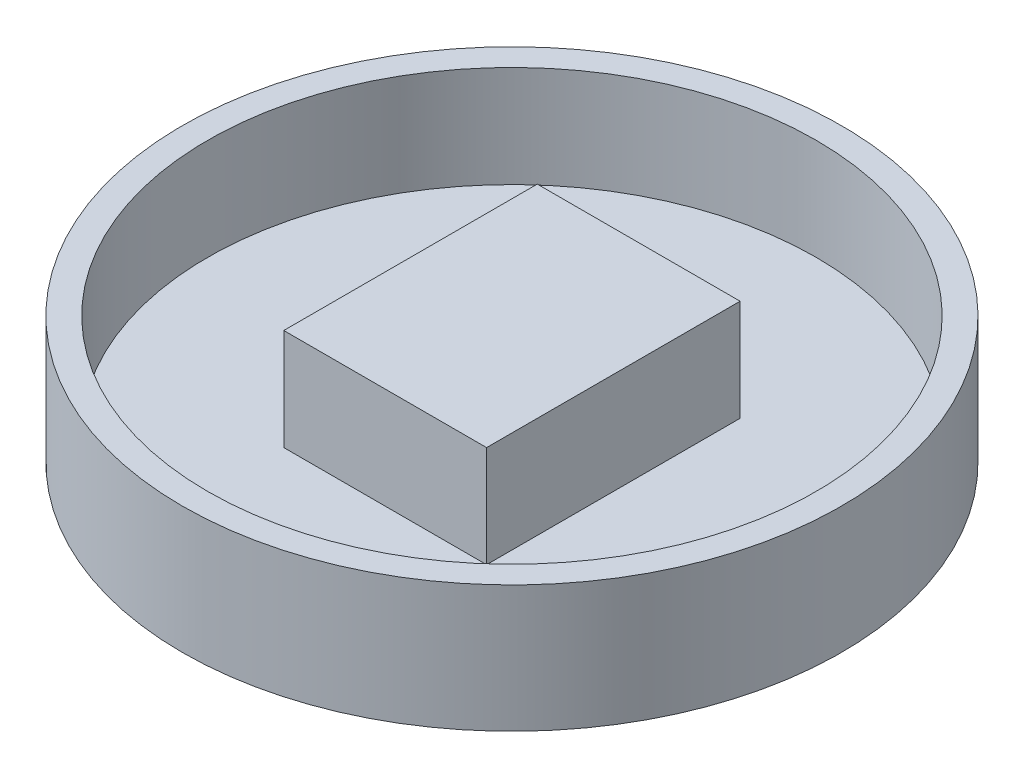
ISO-10303-21;
HEADER;
FILE_DESCRIPTION(('STEP AP214'),'2;1');
FILE_NAME('part.step','',(''),(''),'','','');
FILE_SCHEMA(('AUTOMOTIVE_DESIGN { 1 0 10303 214 1 1 1 1 }'));
ENDSEC;
DATA;
#1=APPLICATION_CONTEXT('core data for automotive mechanical design processes');
#2=APPLICATION_PROTOCOL_DEFINITION('international standard','automotive_design',2000,#1);
#3=PRODUCT_CONTEXT('',#1,'mechanical');
#4=PRODUCT('Part','Part','',(#3));
#5=PRODUCT_RELATED_PRODUCT_CATEGORY('part','',(#4));
#6=PRODUCT_DEFINITION_FORMATION('','',#4);
#7=PRODUCT_DEFINITION_CONTEXT('part definition',#1,'design');
#8=PRODUCT_DEFINITION('design','',#6,#7);
#9=PRODUCT_DEFINITION_SHAPE('','',#8);
#10=(LENGTH_UNIT() NAMED_UNIT(*) SI_UNIT(.MILLI.,.METRE.));
#11=(NAMED_UNIT(*) PLANE_ANGLE_UNIT() SI_UNIT($,.RADIAN.));
#12=(NAMED_UNIT(*) SI_UNIT($,.STERADIAN.) SOLID_ANGLE_UNIT());
#13=UNCERTAINTY_MEASURE_WITH_UNIT(LENGTH_MEASURE(1.E-05),#10,'distance_accuracy_value','');
#14=(GEOMETRIC_REPRESENTATION_CONTEXT(3) GLOBAL_UNCERTAINTY_ASSIGNED_CONTEXT((#13)) GLOBAL_UNIT_ASSIGNED_CONTEXT((#10,
#11,#12)) REPRESENTATION_CONTEXT('',''));
#15=CARTESIAN_POINT('',(0.,0.,0.));
#16=DIRECTION('',(0.,0.,1.));
#17=DIRECTION('',(1.,0.,0.));
#18=AXIS2_PLACEMENT_3D('',#15,#16,#17);
#19=CARTESIAN_POINT('',(0.,5.,0.));
#20=DIRECTION('',(0.,1.,0.));
#21=DIRECTION('',(0.,0.,1.));
#22=AXIS2_PLACEMENT_3D('',#19,#20,#21);
#23=PLANE('',#22);
#24=CARTESIAN_POINT('',(0.,5.,0.));
#25=DIRECTION('',(0.,1.,0.));
#26=DIRECTION('',(0.,0.,1.));
#27=AXIS2_PLACEMENT_3D('',#24,#25,#26);
#28=CIRCLE('',#27,60.);
#29=CARTESIAN_POINT('',(0.,5.,60.));
#30=VERTEX_POINT('',#29);
#31=EDGE_CURVE('E165',#30,#30,#28,.T.);
#32=ORIENTED_EDGE('',*,*,#31,.T.);
#33=EDGE_LOOP('',(#32));
#34=FACE_BOUND('',#33,.T.);
#35=DIRECTION('',(-1.,0.,0.));
#36=VECTOR('',#35,1.);
#37=CARTESIAN_POINT('',(-20.,5.,-25.));
#38=LINE('',#37,#36);
#39=CARTESIAN_POINT('',(20.,5.,-25.));
#40=VERTEX_POINT('',#39);
#41=CARTESIAN_POINT('',(-20.,5.,-25.));
#42=VERTEX_POINT('',#41);
#43=EDGE_CURVE('E151',#40,#42,#38,.T.);
#44=ORIENTED_EDGE('',*,*,#43,.F.);
#45=DIRECTION('',(0.,0.,-1.));
#46=VECTOR('',#45,1.);
#47=CARTESIAN_POINT('',(20.,5.,-25.));
#48=LINE('',#47,#46);
#49=CARTESIAN_POINT('',(20.,5.,25.));
#50=VERTEX_POINT('',#49);
#51=EDGE_CURVE('E134',#50,#40,#48,.T.);
#52=ORIENTED_EDGE('',*,*,#51,.F.);
#53=DIRECTION('',(1.,0.,0.));
#54=VECTOR('',#53,1.);
#55=CARTESIAN_POINT('',(-20.,5.,25.));
#56=LINE('',#55,#54);
#57=CARTESIAN_POINT('',(-20.,5.,25.));
#58=VERTEX_POINT('',#57);
#59=EDGE_CURVE('E142',#58,#50,#56,.T.);
#60=ORIENTED_EDGE('',*,*,#59,.F.);
#61=DIRECTION('',(0.,0.,1.));
#62=VECTOR('',#61,1.);
#63=CARTESIAN_POINT('',(-20.,5.,-25.));
#64=LINE('',#63,#62);
#65=EDGE_CURVE('E153',#42,#58,#64,.T.);
#66=ORIENTED_EDGE('',*,*,#65,.F.);
#67=EDGE_LOOP('',(#44,#52,#60,#66));
#68=FACE_BOUND('',#67,.T.);
#69=ADVANCED_FACE('F33',(#34,#68),#23,.T.);
#70=CARTESIAN_POINT('',(0.,25.,0.));
#71=DIRECTION('',(0.,-1.,0.));
#72=DIRECTION('',(0.,0.,-1.));
#73=AXIS2_PLACEMENT_3D('',#70,#71,#72);
#74=CYLINDRICAL_SURFACE('',#73,65.);
#75=CARTESIAN_POINT('',(0.,25.,0.));
#76=DIRECTION('',(0.,1.,0.));
#77=DIRECTION('',(0.,0.,1.));
#78=AXIS2_PLACEMENT_3D('',#75,#76,#77);
#79=CIRCLE('',#78,65.);
#80=CARTESIAN_POINT('',(0.,25.,65.));
#81=VERTEX_POINT('',#80);
#82=EDGE_CURVE('E11',#81,#81,#79,.T.);
#83=ORIENTED_EDGE('',*,*,#82,.F.);
#84=EDGE_LOOP('',(#83));
#85=FACE_BOUND('',#84,.T.);
#86=CARTESIAN_POINT('',(0.,0.,0.));
#87=DIRECTION('',(0.,1.,0.));
#88=DIRECTION('',(0.,0.,1.));
#89=AXIS2_PLACEMENT_3D('',#86,#87,#88);
#90=CIRCLE('',#89,65.);
#91=CARTESIAN_POINT('',(0.,0.,65.));
#92=VERTEX_POINT('',#91);
#93=EDGE_CURVE('E37',#92,#92,#90,.T.);
#94=ORIENTED_EDGE('',*,*,#93,.T.);
#95=EDGE_LOOP('',(#94));
#96=FACE_BOUND('',#95,.T.);
#97=ADVANCED_FACE('F35',(#85,#96),#74,.T.);
#98=CARTESIAN_POINT('',(0.,25.,0.));
#99=DIRECTION('',(0.,1.,0.));
#100=DIRECTION('',(0.,0.,1.));
#101=AXIS2_PLACEMENT_3D('',#98,#99,#100);
#102=PLANE('',#101);
#103=CARTESIAN_POINT('',(0.,25.,0.));
#104=DIRECTION('',(0.,1.,0.));
#105=DIRECTION('',(0.,0.,1.));
#106=AXIS2_PLACEMENT_3D('',#103,#104,#105);
#107=CIRCLE('',#106,60.);
#108=CARTESIAN_POINT('',(0.,25.,60.));
#109=VERTEX_POINT('',#108);
#110=EDGE_CURVE('E164',#109,#109,#107,.T.);
#111=ORIENTED_EDGE('',*,*,#110,.F.);
#112=EDGE_LOOP('',(#111));
#113=FACE_BOUND('',#112,.T.);
#114=ORIENTED_EDGE('',*,*,#82,.T.);
#115=EDGE_LOOP('',(#114));
#116=FACE_BOUND('',#115,.T.);
#117=ADVANCED_FACE('F173',(#113,#116),#102,.T.);
#118=CARTESIAN_POINT('',(0.,0.,0.));
#119=DIRECTION('',(0.,1.,0.));
#120=DIRECTION('',(0.,0.,1.));
#121=AXIS2_PLACEMENT_3D('',#118,#119,#120);
#122=PLANE('',#121);
#123=DIRECTION('',(-1.,0.,0.));
#124=VECTOR('',#123,1.);
#125=CARTESIAN_POINT('',(-17.5,0.,23.));
#126=LINE('',#125,#124);
#127=CARTESIAN_POINT('',(17.5,0.,23.));
#128=VERTEX_POINT('',#127);
#129=CARTESIAN_POINT('',(-17.5,0.,23.));
#130=VERTEX_POINT('',#129);
#131=EDGE_CURVE('E128',#128,#130,#126,.T.);
#132=ORIENTED_EDGE('',*,*,#131,.F.);
#133=DIRECTION('',(0.,0.,1.));
#134=VECTOR('',#133,1.);
#135=CARTESIAN_POINT('',(17.5,0.,23.));
#136=LINE('',#135,#134);
#137=CARTESIAN_POINT('',(17.5,0.,-4.99999999999999));
#138=VERTEX_POINT('',#137);
#139=EDGE_CURVE('E48',#138,#128,#136,.T.);
#140=ORIENTED_EDGE('',*,*,#139,.F.);
#141=DIRECTION('',(1.,0.,0.));
#142=VECTOR('',#141,1.);
#143=CARTESIAN_POINT('',(-17.5,0.,-5.));
#144=LINE('',#143,#142);
#145=CARTESIAN_POINT('',(-17.5,0.,-5.));
#146=VERTEX_POINT('',#145);
#147=EDGE_CURVE('E119',#146,#138,#144,.T.);
#148=ORIENTED_EDGE('',*,*,#147,.F.);
#149=DIRECTION('',(0.,0.,-1.));
#150=VECTOR('',#149,1.);
#151=CARTESIAN_POINT('',(-17.5,0.,23.));
#152=LINE('',#151,#150);
#153=EDGE_CURVE('E122',#130,#146,#152,.T.);
#154=ORIENTED_EDGE('',*,*,#153,.F.);
#155=EDGE_LOOP('',(#132,#140,#148,#154));
#156=FACE_BOUND('',#155,.T.);
#157=ORIENTED_EDGE('',*,*,#93,.F.);
#158=EDGE_LOOP('',(#157));
#159=FACE_BOUND('',#158,.T.);
#160=ADVANCED_FACE('F176',(#156,#159),#122,.F.);
#161=CARTESIAN_POINT('',(0.,5.,0.));
#162=DIRECTION('',(0.,1.,0.));
#163=DIRECTION('',(0.,0.,1.));
#164=AXIS2_PLACEMENT_3D('',#161,#162,#163);
#165=CYLINDRICAL_SURFACE('',#164,60.);
#166=ORIENTED_EDGE('',*,*,#31,.F.);
#167=EDGE_LOOP('',(#166));
#168=FACE_BOUND('',#167,.T.);
#169=ORIENTED_EDGE('',*,*,#110,.T.);
#170=EDGE_LOOP('',(#169));
#171=FACE_BOUND('',#170,.T.);
#172=ADVANCED_FACE('F171',(#168,#171),#165,.F.);
#173=CARTESIAN_POINT('',(20.,25.,-25.));
#174=DIRECTION('',(-1.,0.,0.));
#175=DIRECTION('',(0.,0.,1.));
#176=AXIS2_PLACEMENT_3D('',#173,#174,#175);
#177=PLANE('',#176);
#178=ORIENTED_EDGE('',*,*,#51,.T.);
#179=DIRECTION('',(0.,-1.,0.));
#180=VECTOR('',#179,1.);
#181=CARTESIAN_POINT('',(20.,25.,-25.));
#182=LINE('',#181,#180);
#183=CARTESIAN_POINT('',(20.,25.,-25.));
#184=VERTEX_POINT('',#183);
#185=EDGE_CURVE('E162',#184,#40,#182,.T.);
#186=ORIENTED_EDGE('',*,*,#185,.F.);
#187=DIRECTION('',(0.,0.,-1.));
#188=VECTOR('',#187,1.);
#189=CARTESIAN_POINT('',(20.,25.,-25.));
#190=LINE('',#189,#188);
#191=CARTESIAN_POINT('',(20.,25.,25.));
#192=VERTEX_POINT('',#191);
#193=EDGE_CURVE('E138',#192,#184,#190,.T.);
#194=ORIENTED_EDGE('',*,*,#193,.F.);
#195=DIRECTION('',(0.,-1.,0.));
#196=VECTOR('',#195,1.);
#197=CARTESIAN_POINT('',(20.,25.,25.));
#198=LINE('',#197,#196);
#199=EDGE_CURVE('E148',#192,#50,#198,.T.);
#200=ORIENTED_EDGE('',*,*,#199,.T.);
#201=EDGE_LOOP('',(#178,#186,#194,#200));
#202=FACE_BOUND('',#201,.T.);
#203=ADVANCED_FACE('F190',(#202),#177,.F.);
#204=CARTESIAN_POINT('',(-20.,25.,-25.));
#205=DIRECTION('',(0.,0.,1.));
#206=DIRECTION('',(1.,0.,0.));
#207=AXIS2_PLACEMENT_3D('',#204,#205,#206);
#208=PLANE('',#207);
#209=ORIENTED_EDGE('',*,*,#43,.T.);
#210=DIRECTION('',(0.,-1.,0.));
#211=VECTOR('',#210,1.);
#212=CARTESIAN_POINT('',(-20.,25.,-25.));
#213=LINE('',#212,#211);
#214=CARTESIAN_POINT('',(-20.,25.,-25.));
#215=VERTEX_POINT('',#214);
#216=EDGE_CURVE('E159',#215,#42,#213,.T.);
#217=ORIENTED_EDGE('',*,*,#216,.F.);
#218=DIRECTION('',(-1.,0.,0.));
#219=VECTOR('',#218,1.);
#220=CARTESIAN_POINT('',(-20.,25.,-25.));
#221=LINE('',#220,#219);
#222=EDGE_CURVE('E141',#184,#215,#221,.T.);
#223=ORIENTED_EDGE('',*,*,#222,.F.);
#224=ORIENTED_EDGE('',*,*,#185,.T.);
#225=EDGE_LOOP('',(#209,#217,#223,#224));
#226=FACE_BOUND('',#225,.T.);
#227=ADVANCED_FACE('F202',(#226),#208,.F.);
#228=CARTESIAN_POINT('',(-20.,25.,-25.));
#229=DIRECTION('',(1.,0.,0.));
#230=DIRECTION('',(0.,0.,-1.));
#231=AXIS2_PLACEMENT_3D('',#228,#229,#230);
#232=PLANE('',#231);
#233=ORIENTED_EDGE('',*,*,#65,.T.);
#234=DIRECTION('',(0.,-1.,0.));
#235=VECTOR('',#234,1.);
#236=CARTESIAN_POINT('',(-20.,25.,25.));
#237=LINE('',#236,#235);
#238=CARTESIAN_POINT('',(-20.,25.,25.));
#239=VERTEX_POINT('',#238);
#240=EDGE_CURVE('E56',#239,#58,#237,.T.);
#241=ORIENTED_EDGE('',*,*,#240,.F.);
#242=DIRECTION('',(0.,0.,1.));
#243=VECTOR('',#242,1.);
#244=CARTESIAN_POINT('',(-20.,25.,-25.));
#245=LINE('',#244,#243);
#246=EDGE_CURVE('E144',#215,#239,#245,.T.);
#247=ORIENTED_EDGE('',*,*,#246,.F.);
#248=ORIENTED_EDGE('',*,*,#216,.T.);
#249=EDGE_LOOP('',(#233,#241,#247,#248));
#250=FACE_BOUND('',#249,.T.);
#251=ADVANCED_FACE('F206',(#250),#232,.F.);
#252=CARTESIAN_POINT('',(-20.,25.,25.));
#253=DIRECTION('',(0.,0.,-1.));
#254=DIRECTION('',(-1.,0.,0.));
#255=AXIS2_PLACEMENT_3D('',#252,#253,#254);
#256=PLANE('',#255);
#257=ORIENTED_EDGE('',*,*,#59,.T.);
#258=ORIENTED_EDGE('',*,*,#199,.F.);
#259=DIRECTION('',(1.,0.,0.));
#260=VECTOR('',#259,1.);
#261=CARTESIAN_POINT('',(-20.,25.,25.));
#262=LINE('',#261,#260);
#263=EDGE_CURVE('E146',#239,#192,#262,.T.);
#264=ORIENTED_EDGE('',*,*,#263,.F.);
#265=ORIENTED_EDGE('',*,*,#240,.T.);
#266=EDGE_LOOP('',(#257,#258,#264,#265));
#267=FACE_BOUND('',#266,.T.);
#268=ADVANCED_FACE('F210',(#267),#256,.F.);
#269=CARTESIAN_POINT('',(0.,25.,0.));
#270=DIRECTION('',(0.,1.,0.));
#271=DIRECTION('',(0.,0.,1.));
#272=AXIS2_PLACEMENT_3D('',#269,#270,#271);
#273=PLANE('',#272);
#274=ORIENTED_EDGE('',*,*,#193,.T.);
#275=ORIENTED_EDGE('',*,*,#222,.T.);
#276=ORIENTED_EDGE('',*,*,#246,.T.);
#277=ORIENTED_EDGE('',*,*,#263,.T.);
#278=EDGE_LOOP('',(#274,#275,#276,#277));
#279=FACE_BOUND('',#278,.T.);
#280=ADVANCED_FACE('F214',(#279),#273,.T.);
#281=CARTESIAN_POINT('',(17.5,18.,23.));
#282=DIRECTION('',(1.,0.,0.));
#283=DIRECTION('',(0.,0.,-1.));
#284=AXIS2_PLACEMENT_3D('',#281,#282,#283);
#285=PLANE('',#284);
#286=ORIENTED_EDGE('',*,*,#139,.T.);
#287=DIRECTION('',(0.,-1.,0.));
#288=VECTOR('',#287,1.);
#289=CARTESIAN_POINT('',(17.5,18.,23.));
#290=LINE('',#289,#288);
#291=CARTESIAN_POINT('',(17.5,18.,23.));
#292=VERTEX_POINT('',#291);
#293=EDGE_CURVE('E97',#292,#128,#290,.T.);
#294=ORIENTED_EDGE('',*,*,#293,.F.);
#295=DIRECTION('',(0.,0.,1.));
#296=VECTOR('',#295,1.);
#297=CARTESIAN_POINT('',(17.5,18.,23.));
#298=LINE('',#297,#296);
#299=CARTESIAN_POINT('',(17.5,18.,-4.99999999999999));
#300=VERTEX_POINT('',#299);
#301=EDGE_CURVE('E101',#300,#292,#298,.T.);
#302=ORIENTED_EDGE('',*,*,#301,.F.);
#303=DIRECTION('',(0.,-1.,0.));
#304=VECTOR('',#303,1.);
#305=CARTESIAN_POINT('',(17.5,18.,-4.99999999999999));
#306=LINE('',#305,#304);
#307=EDGE_CURVE('E132',#300,#138,#306,.T.);
#308=ORIENTED_EDGE('',*,*,#307,.T.);
#309=EDGE_LOOP('',(#286,#294,#302,#308));
#310=FACE_BOUND('',#309,.T.);
#311=ADVANCED_FACE('F99',(#310),#285,.F.);
#312=CARTESIAN_POINT('',(-17.5,18.,-5.));
#313=DIRECTION('',(0.,0.,-1.));
#314=DIRECTION('',(-1.,0.,0.));
#315=AXIS2_PLACEMENT_3D('',#312,#313,#314);
#316=PLANE('',#315);
#317=ORIENTED_EDGE('',*,*,#147,.T.);
#318=ORIENTED_EDGE('',*,*,#307,.F.);
#319=DIRECTION('',(1.,0.,0.));
#320=VECTOR('',#319,1.);
#321=CARTESIAN_POINT('',(-17.5,18.,-5.));
#322=LINE('',#321,#320);
#323=CARTESIAN_POINT('',(-17.5,18.,-5.));
#324=VERTEX_POINT('',#323);
#325=EDGE_CURVE('E107',#324,#300,#322,.T.);
#326=ORIENTED_EDGE('',*,*,#325,.F.);
#327=DIRECTION('',(0.,-1.,0.));
#328=VECTOR('',#327,1.);
#329=CARTESIAN_POINT('',(-17.5,18.,-5.));
#330=LINE('',#329,#328);
#331=EDGE_CURVE('E135',#324,#146,#330,.T.);
#332=ORIENTED_EDGE('',*,*,#331,.T.);
#333=EDGE_LOOP('',(#317,#318,#326,#332));
#334=FACE_BOUND('',#333,.T.);
#335=ADVANCED_FACE('F220',(#334),#316,.F.);
#336=CARTESIAN_POINT('',(-17.5,18.,23.));
#337=DIRECTION('',(-1.,0.,0.));
#338=DIRECTION('',(0.,0.,1.));
#339=AXIS2_PLACEMENT_3D('',#336,#337,#338);
#340=PLANE('',#339);
#341=ORIENTED_EDGE('',*,*,#153,.T.);
#342=ORIENTED_EDGE('',*,*,#331,.F.);
#343=DIRECTION('',(0.,0.,-1.));
#344=VECTOR('',#343,1.);
#345=CARTESIAN_POINT('',(-17.5,18.,23.));
#346=LINE('',#345,#344);
#347=CARTESIAN_POINT('',(-17.5,18.,23.));
#348=VERTEX_POINT('',#347);
#349=EDGE_CURVE('E115',#348,#324,#346,.T.);
#350=ORIENTED_EDGE('',*,*,#349,.F.);
#351=DIRECTION('',(0.,-1.,0.));
#352=VECTOR('',#351,1.);
#353=CARTESIAN_POINT('',(-17.5,18.,23.));
#354=LINE('',#353,#352);
#355=EDGE_CURVE('E106',#348,#130,#354,.T.);
#356=ORIENTED_EDGE('',*,*,#355,.T.);
#357=EDGE_LOOP('',(#341,#342,#350,#356));
#358=FACE_BOUND('',#357,.T.);
#359=ADVANCED_FACE('F223',(#358),#340,.F.);
#360=CARTESIAN_POINT('',(-17.5,18.,23.));
#361=DIRECTION('',(0.,0.,1.));
#362=DIRECTION('',(1.,0.,0.));
#363=AXIS2_PLACEMENT_3D('',#360,#361,#362);
#364=PLANE('',#363);
#365=ORIENTED_EDGE('',*,*,#131,.T.);
#366=ORIENTED_EDGE('',*,*,#355,.F.);
#367=DIRECTION('',(-1.,0.,0.));
#368=VECTOR('',#367,1.);
#369=CARTESIAN_POINT('',(-17.5,18.,23.));
#370=LINE('',#369,#368);
#371=EDGE_CURVE('E110',#292,#348,#370,.T.);
#372=ORIENTED_EDGE('',*,*,#371,.F.);
#373=ORIENTED_EDGE('',*,*,#293,.T.);
#374=EDGE_LOOP('',(#365,#366,#372,#373));
#375=FACE_BOUND('',#374,.T.);
#376=ADVANCED_FACE('F111',(#375),#364,.F.);
#377=CARTESIAN_POINT('',(0.,18.,0.));
#378=DIRECTION('',(0.,-1.,0.));
#379=DIRECTION('',(0.,0.,-1.));
#380=AXIS2_PLACEMENT_3D('',#377,#378,#379);
#381=PLANE('',#380);
#382=ORIENTED_EDGE('',*,*,#301,.T.);
#383=ORIENTED_EDGE('',*,*,#371,.T.);
#384=ORIENTED_EDGE('',*,*,#349,.T.);
#385=ORIENTED_EDGE('',*,*,#325,.T.);
#386=EDGE_LOOP('',(#382,#383,#384,#385));
#387=FACE_BOUND('',#386,.T.);
#388=ADVANCED_FACE('F117',(#387),#381,.T.);
#389=CLOSED_SHELL('',(#69,#97,#117,#160,#172,#203,#227,#251,#268,#280,#311,#335,#359,#376,#388));
#390=MANIFOLD_SOLID_BREP('B2',#389);
#391=ADVANCED_BREP_SHAPE_REPRESENTATION('',(#18,#390),#14);
#392=SHAPE_DEFINITION_REPRESENTATION(#9,#391);
ENDSEC;
END-ISO-10303-21;
